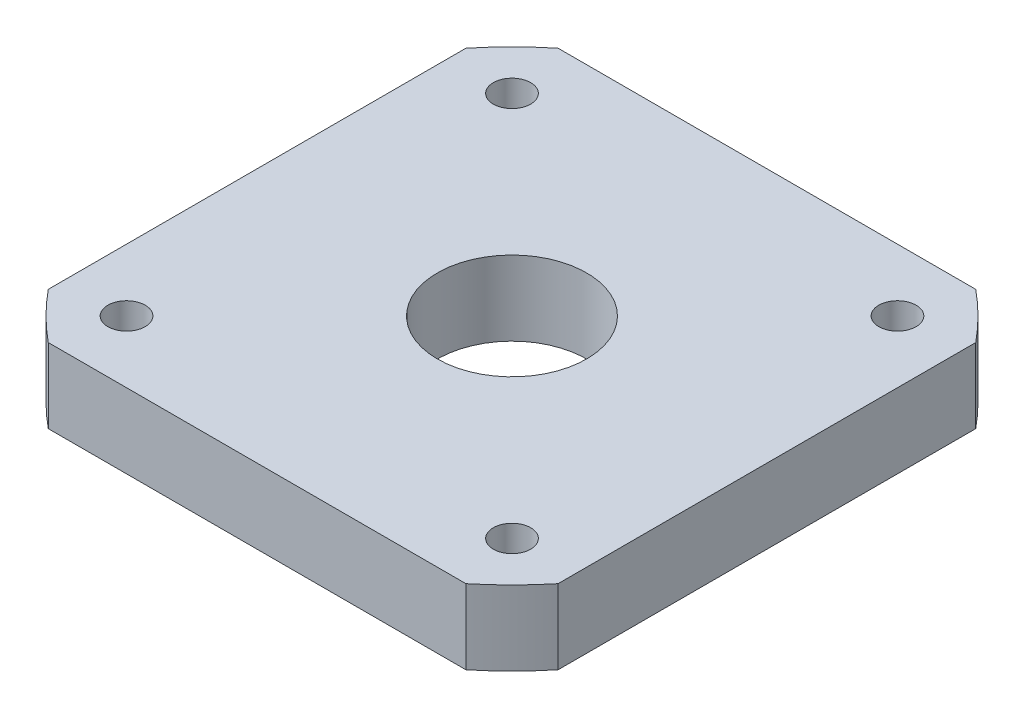
ISO-10303-21;
HEADER;
FILE_DESCRIPTION(('STEP AP214'),'2;1');
FILE_NAME('part.step','',(''),(''),'','','');
FILE_SCHEMA(('AUTOMOTIVE_DESIGN { 1 0 10303 214 1 1 1 1 }'));
ENDSEC;
DATA;
#1=APPLICATION_CONTEXT('core data for automotive mechanical design processes');
#2=APPLICATION_PROTOCOL_DEFINITION('international standard','automotive_design',2000,#1);
#3=PRODUCT_CONTEXT('',#1,'mechanical');
#4=PRODUCT('Part','Part','',(#3));
#5=PRODUCT_RELATED_PRODUCT_CATEGORY('part','',(#4));
#6=PRODUCT_DEFINITION_FORMATION('','',#4);
#7=PRODUCT_DEFINITION_CONTEXT('part definition',#1,'design');
#8=PRODUCT_DEFINITION('design','',#6,#7);
#9=PRODUCT_DEFINITION_SHAPE('','',#8);
#10=(LENGTH_UNIT() NAMED_UNIT(*) SI_UNIT(.MILLI.,.METRE.));
#11=(NAMED_UNIT(*) PLANE_ANGLE_UNIT() SI_UNIT($,.RADIAN.));
#12=(NAMED_UNIT(*) SI_UNIT($,.STERADIAN.) SOLID_ANGLE_UNIT());
#13=UNCERTAINTY_MEASURE_WITH_UNIT(LENGTH_MEASURE(1.E-05),#10,'distance_accuracy_value','');
#14=(GEOMETRIC_REPRESENTATION_CONTEXT(3) GLOBAL_UNCERTAINTY_ASSIGNED_CONTEXT((#13)) GLOBAL_UNIT_ASSIGNED_CONTEXT((#10,
#11,#12)) REPRESENTATION_CONTEXT('',''));
#15=CARTESIAN_POINT('',(0.,0.,0.));
#16=DIRECTION('',(0.,0.,1.));
#17=DIRECTION('',(1.,0.,0.));
#18=AXIS2_PLACEMENT_3D('',#15,#16,#17);
#19=CARTESIAN_POINT('',(0.,6.,0.));
#20=DIRECTION('',(0.,1.,0.));
#21=DIRECTION('',(0.,0.,1.));
#22=AXIS2_PLACEMENT_3D('',#19,#20,#21);
#23=PLANE('',#22);
#24=CARTESIAN_POINT('',(15.5000000000017,5.99999999999991,15.5));
#25=DIRECTION('',(0.,1.,0.));
#26=DIRECTION('',(0.,0.,1.));
#27=AXIS2_PLACEMENT_3D('',#24,#25,#26);
#28=CIRCLE('',#27,1.49999999999842);
#29=CARTESIAN_POINT('',(15.5000000000017,5.9999999999999,16.9999999999985));
#30=VERTEX_POINT('',#29);
#31=EDGE_CURVE('E199',#30,#30,#28,.T.);
#32=ORIENTED_EDGE('',*,*,#31,.F.);
#33=EDGE_LOOP('',(#32));
#34=FACE_BOUND('',#33,.T.);
#35=CARTESIAN_POINT('',(15.5000000000016,6.00000000000009,-15.5));
#36=DIRECTION('',(0.,1.,0.));
#37=DIRECTION('',(0.,0.,1.));
#38=AXIS2_PLACEMENT_3D('',#35,#36,#37);
#39=CIRCLE('',#38,1.49999999999842);
#40=CARTESIAN_POINT('',(15.5000000000016,6.00000000000008,-14.0000000000015));
#41=VERTEX_POINT('',#40);
#42=EDGE_CURVE('E189',#41,#41,#39,.T.);
#43=ORIENTED_EDGE('',*,*,#42,.F.);
#44=EDGE_LOOP('',(#43));
#45=FACE_BOUND('',#44,.T.);
#46=CARTESIAN_POINT('',(0.,6.,0.));
#47=DIRECTION('',(0.,1.,0.));
#48=DIRECTION('',(0.,0.,1.));
#49=AXIS2_PLACEMENT_3D('',#46,#47,#48);
#50=CIRCLE('',#49,26.5000000000002);
#51=CARTESIAN_POINT('',(20.5,6.0000000000001,-16.792855623747));
#52=VERTEX_POINT('',#51);
#53=CARTESIAN_POINT('',(16.792855623747,6.00000000000012,-20.5));
#54=VERTEX_POINT('',#53);
#55=EDGE_CURVE('E151',#52,#54,#50,.T.);
#56=ORIENTED_EDGE('',*,*,#55,.T.);
#57=DIRECTION('',(-1.,0.,0.));
#58=VECTOR('',#57,1.);
#59=CARTESIAN_POINT('',(16.792855623747,6.00000000000012,-20.5));
#60=LINE('',#59,#58);
#61=CARTESIAN_POINT('',(-16.79285562374,6.00000000000012,-20.5));
#62=VERTEX_POINT('',#61);
#63=EDGE_CURVE('E97',#54,#62,#60,.T.);
#64=ORIENTED_EDGE('',*,*,#63,.T.);
#65=CARTESIAN_POINT('',(0.,6.,0.));
#66=DIRECTION('',(0.,1.,0.));
#67=DIRECTION('',(0.,0.,1.));
#68=AXIS2_PLACEMENT_3D('',#65,#66,#67);
#69=CIRCLE('',#68,26.4999999999969);
#70=CARTESIAN_POINT('',(-20.4999999999974,6.0000000000001,-16.7928556237449));
#71=VERTEX_POINT('',#70);
#72=EDGE_CURVE('E167',#62,#71,#69,.T.);
#73=ORIENTED_EDGE('',*,*,#72,.T.);
#74=DIRECTION('',(0.,0.,1.));
#75=VECTOR('',#74,1.);
#76=CARTESIAN_POINT('',(-20.4999999999983,6.0000000000001,-16.7928556237456));
#77=LINE('',#76,#75);
#78=CARTESIAN_POINT('',(-20.5,5.9999999999999,16.79285562374));
#79=VERTEX_POINT('',#78);
#80=EDGE_CURVE('E176',#71,#79,#77,.T.);
#81=ORIENTED_EDGE('',*,*,#80,.T.);
#82=CARTESIAN_POINT('',(0.,6.,0.));
#83=DIRECTION('',(0.,1.,0.));
#84=DIRECTION('',(0.,0.,1.));
#85=AXIS2_PLACEMENT_3D('',#82,#83,#84);
#86=CIRCLE('',#85,26.4999999999958);
#87=CARTESIAN_POINT('',(-16.79285562374,5.99999999999988,20.5));
#88=VERTEX_POINT('',#87);
#89=EDGE_CURVE('E119',#79,#88,#86,.T.);
#90=ORIENTED_EDGE('',*,*,#89,.T.);
#91=DIRECTION('',(1.,0.,0.));
#92=VECTOR('',#91,1.);
#93=CARTESIAN_POINT('',(-16.79285562374,5.99999999999988,20.5));
#94=LINE('',#93,#92);
#95=CARTESIAN_POINT('',(16.792855623747,5.99999999999988,20.5));
#96=VERTEX_POINT('',#95);
#97=EDGE_CURVE('E115',#88,#96,#94,.T.);
#98=ORIENTED_EDGE('',*,*,#97,.T.);
#99=CARTESIAN_POINT('',(0.,6.,0.));
#100=DIRECTION('',(0.,1.,0.));
#101=DIRECTION('',(0.,0.,1.));
#102=AXIS2_PLACEMENT_3D('',#99,#100,#101);
#103=CIRCLE('',#102,26.4999999999991);
#104=CARTESIAN_POINT('',(20.5000000000026,5.9999999999999,16.7928556237421));
#105=VERTEX_POINT('',#104);
#106=EDGE_CURVE('E117',#96,#105,#103,.T.);
#107=ORIENTED_EDGE('',*,*,#106,.T.);
#108=DIRECTION('',(0.,0.,-1.));
#109=VECTOR('',#108,1.);
#110=CARTESIAN_POINT('',(20.5000000000017,5.9999999999999,16.7928556237414));
#111=LINE('',#110,#109);
#112=EDGE_CURVE('E57',#105,#52,#111,.T.);
#113=ORIENTED_EDGE('',*,*,#112,.T.);
#114=EDGE_LOOP('',(#56,#64,#73,#81,#90,#98,#107,#113));
#115=FACE_BOUND('',#114,.T.);
#116=CARTESIAN_POINT('',(0.,6.,0.));
#117=DIRECTION('',(0.,1.,0.));
#118=DIRECTION('',(0.,0.,1.));
#119=AXIS2_PLACEMENT_3D('',#116,#117,#118);
#120=CIRCLE('',#119,6.);
#121=CARTESIAN_POINT('',(0.,5.99999999999997,6.00000000000003));
#122=VERTEX_POINT('',#121);
#123=EDGE_CURVE('E138',#122,#122,#120,.T.);
#124=ORIENTED_EDGE('',*,*,#123,.F.);
#125=EDGE_LOOP('',(#124));
#126=FACE_BOUND('',#125,.T.);
#127=CARTESIAN_POINT('',(-15.5,6.00000000000009,-15.5));
#128=DIRECTION('',(0.,1.,0.));
#129=DIRECTION('',(0.,0.,1.));
#130=AXIS2_PLACEMENT_3D('',#127,#128,#129);
#131=CIRCLE('',#130,1.5);
#132=CARTESIAN_POINT('',(-15.5,6.00000000000008,-14.));
#133=VERTEX_POINT('',#132);
#134=EDGE_CURVE('E191',#133,#133,#131,.T.);
#135=ORIENTED_EDGE('',*,*,#134,.F.);
#136=EDGE_LOOP('',(#135));
#137=FACE_BOUND('',#136,.T.);
#138=CARTESIAN_POINT('',(-15.5,5.99999999999991,15.5));
#139=DIRECTION('',(0.,1.,0.));
#140=DIRECTION('',(0.,0.,1.));
#141=AXIS2_PLACEMENT_3D('',#138,#139,#140);
#142=CIRCLE('',#141,1.5);
#143=CARTESIAN_POINT('',(-15.5,5.9999999999999,17.));
#144=VERTEX_POINT('',#143);
#145=EDGE_CURVE('E206',#144,#144,#142,.T.);
#146=ORIENTED_EDGE('',*,*,#145,.F.);
#147=EDGE_LOOP('',(#146));
#148=FACE_BOUND('',#147,.T.);
#149=ADVANCED_FACE('F39',(#34,#45,#115,#126,#137,#148),#23,.T.);
#150=CARTESIAN_POINT('',(0.,0.,0.));
#151=DIRECTION('',(0.,1.,0.));
#152=DIRECTION('',(0.,0.,1.));
#153=AXIS2_PLACEMENT_3D('',#150,#151,#152);
#154=PLANE('',#153);
#155=CARTESIAN_POINT('',(0.,0.,0.));
#156=DIRECTION('',(0.,1.,0.));
#157=DIRECTION('',(0.,0.,1.));
#158=AXIS2_PLACEMENT_3D('',#155,#156,#157);
#159=CIRCLE('',#158,26.5000000000002);
#160=CARTESIAN_POINT('',(20.5,0.,-16.792855623747));
#161=VERTEX_POINT('',#160);
#162=CARTESIAN_POINT('',(16.792855623747,1.18140734892568E-13,-20.5));
#163=VERTEX_POINT('',#162);
#164=EDGE_CURVE('E137',#161,#163,#159,.T.);
#165=ORIENTED_EDGE('',*,*,#164,.F.);
#166=DIRECTION('',(0.,0.,-1.));
#167=VECTOR('',#166,1.);
#168=CARTESIAN_POINT('',(20.5000000000017,0.,16.7928556237414));
#169=LINE('',#168,#167);
#170=CARTESIAN_POINT('',(20.5000000000026,0.,16.7928556237421));
#171=VERTEX_POINT('',#170);
#172=EDGE_CURVE('E93',#171,#161,#169,.T.);
#173=ORIENTED_EDGE('',*,*,#172,.F.);
#174=CARTESIAN_POINT('',(0.,0.,0.));
#175=DIRECTION('',(0.,1.,0.));
#176=DIRECTION('',(0.,0.,1.));
#177=AXIS2_PLACEMENT_3D('',#174,#175,#176);
#178=CIRCLE('',#177,26.4999999999991);
#179=CARTESIAN_POINT('',(16.792855623747,-1.18140734892568E-13,20.5));
#180=VERTEX_POINT('',#179);
#181=EDGE_CURVE('E83',#180,#171,#178,.T.);
#182=ORIENTED_EDGE('',*,*,#181,.F.);
#183=DIRECTION('',(1.,0.,0.));
#184=VECTOR('',#183,1.);
#185=CARTESIAN_POINT('',(-16.79285562374,-1.18140734892568E-13,20.5));
#186=LINE('',#185,#184);
#187=CARTESIAN_POINT('',(-16.79285562374,-1.18140734892568E-13,20.5));
#188=VERTEX_POINT('',#187);
#189=EDGE_CURVE('E127',#188,#180,#186,.T.);
#190=ORIENTED_EDGE('',*,*,#189,.F.);
#191=CARTESIAN_POINT('',(0.,0.,0.));
#192=DIRECTION('',(0.,1.,0.));
#193=DIRECTION('',(0.,0.,1.));
#194=AXIS2_PLACEMENT_3D('',#191,#192,#193);
#195=CIRCLE('',#194,26.4999999999958);
#196=CARTESIAN_POINT('',(-20.5,0.,16.79285562374));
#197=VERTEX_POINT('',#196);
#198=EDGE_CURVE('E148',#197,#188,#195,.T.);
#199=ORIENTED_EDGE('',*,*,#198,.F.);
#200=DIRECTION('',(0.,0.,1.));
#201=VECTOR('',#200,1.);
#202=CARTESIAN_POINT('',(-20.4999999999983,0.,-16.7928556237456));
#203=LINE('',#202,#201);
#204=CARTESIAN_POINT('',(-20.4999999999974,0.,-16.7928556237449));
#205=VERTEX_POINT('',#204);
#206=EDGE_CURVE('E145',#205,#197,#203,.T.);
#207=ORIENTED_EDGE('',*,*,#206,.F.);
#208=CARTESIAN_POINT('',(0.,0.,0.));
#209=DIRECTION('',(0.,1.,0.));
#210=DIRECTION('',(0.,0.,1.));
#211=AXIS2_PLACEMENT_3D('',#208,#209,#210);
#212=CIRCLE('',#211,26.4999999999969);
#213=CARTESIAN_POINT('',(-16.79285562374,1.18140734892568E-13,-20.5));
#214=VERTEX_POINT('',#213);
#215=EDGE_CURVE('E142',#214,#205,#212,.T.);
#216=ORIENTED_EDGE('',*,*,#215,.F.);
#217=DIRECTION('',(-1.,0.,0.));
#218=VECTOR('',#217,1.);
#219=CARTESIAN_POINT('',(16.792855623747,1.18140734892568E-13,-20.5));
#220=LINE('',#219,#218);
#221=EDGE_CURVE('E136',#163,#214,#220,.T.);
#222=ORIENTED_EDGE('',*,*,#221,.F.);
#223=EDGE_LOOP('',(#165,#173,#182,#190,#199,#207,#216,#222));
#224=FACE_BOUND('',#223,.T.);
#225=CARTESIAN_POINT('',(0.,0.,0.));
#226=DIRECTION('',(0.,1.,0.));
#227=DIRECTION('',(0.,0.,1.));
#228=AXIS2_PLACEMENT_3D('',#225,#226,#227);
#229=CIRCLE('',#228,6.);
#230=CARTESIAN_POINT('',(0.,0.,6.));
#231=VERTEX_POINT('',#230);
#232=EDGE_CURVE('E183',#231,#231,#229,.T.);
#233=ORIENTED_EDGE('',*,*,#232,.T.);
#234=EDGE_LOOP('',(#233));
#235=FACE_BOUND('',#234,.T.);
#236=CARTESIAN_POINT('',(15.5000000000016,0.,-15.5));
#237=DIRECTION('',(0.,1.,0.));
#238=DIRECTION('',(0.,0.,1.));
#239=AXIS2_PLACEMENT_3D('',#236,#237,#238);
#240=CIRCLE('',#239,1.49999999999842);
#241=CARTESIAN_POINT('',(15.5000000000016,0.,-14.0000000000016));
#242=VERTEX_POINT('',#241);
#243=EDGE_CURVE('E192',#242,#242,#240,.T.);
#244=ORIENTED_EDGE('',*,*,#243,.T.);
#245=EDGE_LOOP('',(#244));
#246=FACE_BOUND('',#245,.T.);
#247=CARTESIAN_POINT('',(-15.5,0.,-15.5));
#248=DIRECTION('',(0.,1.,0.));
#249=DIRECTION('',(0.,0.,1.));
#250=AXIS2_PLACEMENT_3D('',#247,#248,#249);
#251=CIRCLE('',#250,1.5);
#252=CARTESIAN_POINT('',(-15.5,0.,-14.));
#253=VERTEX_POINT('',#252);
#254=EDGE_CURVE('E197',#253,#253,#251,.T.);
#255=ORIENTED_EDGE('',*,*,#254,.T.);
#256=EDGE_LOOP('',(#255));
#257=FACE_BOUND('',#256,.T.);
#258=CARTESIAN_POINT('',(15.5000000000017,0.,15.5));
#259=DIRECTION('',(0.,1.,0.));
#260=DIRECTION('',(0.,0.,1.));
#261=AXIS2_PLACEMENT_3D('',#258,#259,#260);
#262=CIRCLE('',#261,1.49999999999842);
#263=CARTESIAN_POINT('',(15.5000000000017,0.,16.9999999999984));
#264=VERTEX_POINT('',#263);
#265=EDGE_CURVE('E201',#264,#264,#262,.T.);
#266=ORIENTED_EDGE('',*,*,#265,.T.);
#267=EDGE_LOOP('',(#266));
#268=FACE_BOUND('',#267,.T.);
#269=CARTESIAN_POINT('',(-15.5,0.,15.5));
#270=DIRECTION('',(0.,1.,0.));
#271=DIRECTION('',(0.,0.,1.));
#272=AXIS2_PLACEMENT_3D('',#269,#270,#271);
#273=CIRCLE('',#272,1.5);
#274=CARTESIAN_POINT('',(-15.5,0.,17.));
#275=VERTEX_POINT('',#274);
#276=EDGE_CURVE('E207',#275,#275,#273,.T.);
#277=ORIENTED_EDGE('',*,*,#276,.T.);
#278=EDGE_LOOP('',(#277));
#279=FACE_BOUND('',#278,.T.);
#280=ADVANCED_FACE('F168',(#224,#235,#246,#257,#268,#279),#154,.F.);
#281=CARTESIAN_POINT('',(0.,6.,0.));
#282=DIRECTION('',(0.,-1.,0.));
#283=DIRECTION('',(0.,0.,-1.));
#284=AXIS2_PLACEMENT_3D('',#281,#282,#283);
#285=CYLINDRICAL_SURFACE('',#284,26.5000000000002);
#286=ORIENTED_EDGE('',*,*,#164,.T.);
#287=DIRECTION('',(0.,-1.,0.));
#288=VECTOR('',#287,1.);
#289=CARTESIAN_POINT('',(16.792855623747,6.00000000000012,-20.5));
#290=LINE('',#289,#288);
#291=EDGE_CURVE('E11',#54,#163,#290,.T.);
#292=ORIENTED_EDGE('',*,*,#291,.F.);
#293=ORIENTED_EDGE('',*,*,#55,.F.);
#294=DIRECTION('',(0.,-1.,0.));
#295=VECTOR('',#294,1.);
#296=CARTESIAN_POINT('',(20.5,6.0000000000001,-16.792855623747));
#297=LINE('',#296,#295);
#298=EDGE_CURVE('E135',#52,#161,#297,.T.);
#299=ORIENTED_EDGE('',*,*,#298,.T.);
#300=EDGE_LOOP('',(#286,#292,#293,#299));
#301=FACE_BOUND('',#300,.T.);
#302=ADVANCED_FACE('F41',(#301),#285,.T.);
#303=CARTESIAN_POINT('',(16.792855623747,6.00000000000012,-20.5));
#304=DIRECTION('',(0.,0.,1.));
#305=DIRECTION('',(0.,-1.,0.));
#306=AXIS2_PLACEMENT_3D('',#303,#304,#305);
#307=PLANE('',#306);
#308=ORIENTED_EDGE('',*,*,#221,.T.);
#309=DIRECTION('',(0.,-1.,0.));
#310=VECTOR('',#309,1.);
#311=CARTESIAN_POINT('',(-16.79285562374,6.00000000000012,-20.5));
#312=LINE('',#311,#310);
#313=EDGE_CURVE('E48',#62,#214,#312,.T.);
#314=ORIENTED_EDGE('',*,*,#313,.F.);
#315=ORIENTED_EDGE('',*,*,#63,.F.);
#316=ORIENTED_EDGE('',*,*,#291,.T.);
#317=EDGE_LOOP('',(#308,#314,#315,#316));
#318=FACE_BOUND('',#317,.T.);
#319=ADVANCED_FACE('F244',(#318),#307,.F.);
#320=CARTESIAN_POINT('',(0.,6.,0.));
#321=DIRECTION('',(0.,-1.,0.));
#322=DIRECTION('',(0.,0.,-1.));
#323=AXIS2_PLACEMENT_3D('',#320,#321,#322);
#324=CYLINDRICAL_SURFACE('',#323,26.4999999999969);
#325=ORIENTED_EDGE('',*,*,#215,.T.);
#326=DIRECTION('',(0.,-1.,0.));
#327=VECTOR('',#326,1.);
#328=CARTESIAN_POINT('',(-20.4999999999974,6.0000000000001,-16.7928556237449));
#329=LINE('',#328,#327);
#330=EDGE_CURVE('E158',#71,#205,#329,.T.);
#331=ORIENTED_EDGE('',*,*,#330,.F.);
#332=ORIENTED_EDGE('',*,*,#72,.F.);
#333=ORIENTED_EDGE('',*,*,#313,.T.);
#334=EDGE_LOOP('',(#325,#331,#332,#333));
#335=FACE_BOUND('',#334,.T.);
#336=ADVANCED_FACE('F163',(#335),#324,.T.);
#337=CARTESIAN_POINT('',(-20.4999999999983,6.0000000000001,-16.7928556237456));
#338=DIRECTION('',(1.,0.,0.));
#339=DIRECTION('',(0.,0.,-1.));
#340=AXIS2_PLACEMENT_3D('',#337,#338,#339);
#341=PLANE('',#340);
#342=ORIENTED_EDGE('',*,*,#206,.T.);
#343=DIRECTION('',(0.,-1.,0.));
#344=VECTOR('',#343,1.);
#345=CARTESIAN_POINT('',(-20.5,5.9999999999999,16.79285562374));
#346=LINE('',#345,#344);
#347=EDGE_CURVE('E154',#79,#197,#346,.T.);
#348=ORIENTED_EDGE('',*,*,#347,.F.);
#349=ORIENTED_EDGE('',*,*,#80,.F.);
#350=ORIENTED_EDGE('',*,*,#330,.T.);
#351=EDGE_LOOP('',(#342,#348,#349,#350));
#352=FACE_BOUND('',#351,.T.);
#353=ADVANCED_FACE('F173',(#352),#341,.F.);
#354=CARTESIAN_POINT('',(0.,6.,0.));
#355=DIRECTION('',(0.,-1.,0.));
#356=DIRECTION('',(0.,0.,-1.));
#357=AXIS2_PLACEMENT_3D('',#354,#355,#356);
#358=CYLINDRICAL_SURFACE('',#357,26.4999999999958);
#359=ORIENTED_EDGE('',*,*,#198,.T.);
#360=DIRECTION('',(0.,-1.,0.));
#361=VECTOR('',#360,1.);
#362=CARTESIAN_POINT('',(-16.79285562374,5.99999999999988,20.5));
#363=LINE('',#362,#361);
#364=EDGE_CURVE('E130',#88,#188,#363,.T.);
#365=ORIENTED_EDGE('',*,*,#364,.F.);
#366=ORIENTED_EDGE('',*,*,#89,.F.);
#367=ORIENTED_EDGE('',*,*,#347,.T.);
#368=EDGE_LOOP('',(#359,#365,#366,#367));
#369=FACE_BOUND('',#368,.T.);
#370=ADVANCED_FACE('F179',(#369),#358,.T.);
#371=CARTESIAN_POINT('',(-16.79285562374,5.99999999999988,20.5));
#372=DIRECTION('',(0.,0.,-1.));
#373=DIRECTION('',(0.,1.,0.));
#374=AXIS2_PLACEMENT_3D('',#371,#372,#373);
#375=PLANE('',#374);
#376=ORIENTED_EDGE('',*,*,#189,.T.);
#377=DIRECTION('',(0.,-1.,0.));
#378=VECTOR('',#377,1.);
#379=CARTESIAN_POINT('',(16.792855623747,5.99999999999988,20.5));
#380=LINE('',#379,#378);
#381=EDGE_CURVE('E124',#96,#180,#380,.T.);
#382=ORIENTED_EDGE('',*,*,#381,.F.);
#383=ORIENTED_EDGE('',*,*,#97,.F.);
#384=ORIENTED_EDGE('',*,*,#364,.T.);
#385=EDGE_LOOP('',(#376,#382,#383,#384));
#386=FACE_BOUND('',#385,.T.);
#387=ADVANCED_FACE('F121',(#386),#375,.F.);
#388=CARTESIAN_POINT('',(0.,6.,0.));
#389=DIRECTION('',(0.,-1.,0.));
#390=DIRECTION('',(0.,0.,-1.));
#391=AXIS2_PLACEMENT_3D('',#388,#389,#390);
#392=CYLINDRICAL_SURFACE('',#391,26.4999999999991);
#393=ORIENTED_EDGE('',*,*,#181,.T.);
#394=DIRECTION('',(0.,-1.,0.));
#395=VECTOR('',#394,1.);
#396=CARTESIAN_POINT('',(20.5000000000026,5.9999999999999,16.7928556237421));
#397=LINE('',#396,#395);
#398=EDGE_CURVE('E126',#105,#171,#397,.T.);
#399=ORIENTED_EDGE('',*,*,#398,.F.);
#400=ORIENTED_EDGE('',*,*,#106,.F.);
#401=ORIENTED_EDGE('',*,*,#381,.T.);
#402=EDGE_LOOP('',(#393,#399,#400,#401));
#403=FACE_BOUND('',#402,.T.);
#404=ADVANCED_FACE('F128',(#403),#392,.T.);
#405=CARTESIAN_POINT('',(20.5000000000017,5.9999999999999,16.7928556237414));
#406=DIRECTION('',(-1.,0.,0.));
#407=DIRECTION('',(0.,0.,1.));
#408=AXIS2_PLACEMENT_3D('',#405,#406,#407);
#409=PLANE('',#408);
#410=ORIENTED_EDGE('',*,*,#172,.T.);
#411=ORIENTED_EDGE('',*,*,#298,.F.);
#412=ORIENTED_EDGE('',*,*,#112,.F.);
#413=ORIENTED_EDGE('',*,*,#398,.T.);
#414=EDGE_LOOP('',(#410,#411,#412,#413));
#415=FACE_BOUND('',#414,.T.);
#416=ADVANCED_FACE('F232',(#415),#409,.F.);
#417=CARTESIAN_POINT('',(0.,6.,0.));
#418=DIRECTION('',(0.,-1.,0.));
#419=DIRECTION('',(0.,0.,-1.));
#420=AXIS2_PLACEMENT_3D('',#417,#418,#419);
#421=CYLINDRICAL_SURFACE('',#420,6.);
#422=ORIENTED_EDGE('',*,*,#123,.T.);
#423=EDGE_LOOP('',(#422));
#424=FACE_BOUND('',#423,.T.);
#425=ORIENTED_EDGE('',*,*,#232,.F.);
#426=EDGE_LOOP('',(#425));
#427=FACE_BOUND('',#426,.T.);
#428=ADVANCED_FACE('F229',(#424,#427),#421,.F.);
#429=CARTESIAN_POINT('',(15.5000000000016,6.00000000000009,-15.5));
#430=DIRECTION('',(0.,-1.,0.));
#431=DIRECTION('',(0.,0.,-1.));
#432=AXIS2_PLACEMENT_3D('',#429,#430,#431);
#433=CYLINDRICAL_SURFACE('',#432,1.49999999999842);
#434=ORIENTED_EDGE('',*,*,#42,.T.);
#435=EDGE_LOOP('',(#434));
#436=FACE_BOUND('',#435,.T.);
#437=ORIENTED_EDGE('',*,*,#243,.F.);
#438=EDGE_LOOP('',(#437));
#439=FACE_BOUND('',#438,.T.);
#440=ADVANCED_FACE('F308',(#436,#439),#433,.F.);
#441=CARTESIAN_POINT('',(-15.5,6.00000000000009,-15.5));
#442=DIRECTION('',(0.,-1.,0.));
#443=DIRECTION('',(0.,0.,-1.));
#444=AXIS2_PLACEMENT_3D('',#441,#442,#443);
#445=CYLINDRICAL_SURFACE('',#444,1.5);
#446=ORIENTED_EDGE('',*,*,#134,.T.);
#447=EDGE_LOOP('',(#446));
#448=FACE_BOUND('',#447,.T.);
#449=ORIENTED_EDGE('',*,*,#254,.F.);
#450=EDGE_LOOP('',(#449));
#451=FACE_BOUND('',#450,.T.);
#452=ADVANCED_FACE('F314',(#448,#451),#445,.F.);
#453=CARTESIAN_POINT('',(15.5000000000017,5.99999999999991,15.5));
#454=DIRECTION('',(0.,-1.,0.));
#455=DIRECTION('',(0.,0.,-1.));
#456=AXIS2_PLACEMENT_3D('',#453,#454,#455);
#457=CYLINDRICAL_SURFACE('',#456,1.49999999999842);
#458=ORIENTED_EDGE('',*,*,#31,.T.);
#459=EDGE_LOOP('',(#458));
#460=FACE_BOUND('',#459,.T.);
#461=ORIENTED_EDGE('',*,*,#265,.F.);
#462=EDGE_LOOP('',(#461));
#463=FACE_BOUND('',#462,.T.);
#464=ADVANCED_FACE('F325',(#460,#463),#457,.F.);
#465=CARTESIAN_POINT('',(-15.5,5.99999999999991,15.5));
#466=DIRECTION('',(0.,-1.,0.));
#467=DIRECTION('',(0.,0.,-1.));
#468=AXIS2_PLACEMENT_3D('',#465,#466,#467);
#469=CYLINDRICAL_SURFACE('',#468,1.5);
#470=ORIENTED_EDGE('',*,*,#145,.T.);
#471=EDGE_LOOP('',(#470));
#472=FACE_BOUND('',#471,.T.);
#473=ORIENTED_EDGE('',*,*,#276,.F.);
#474=EDGE_LOOP('',(#473));
#475=FACE_BOUND('',#474,.T.);
#476=ADVANCED_FACE('F214',(#472,#475),#469,.F.);
#477=CLOSED_SHELL('',(#149,#280,#302,#319,#336,#353,#370,#387,#404,#416,#428,#440,#452,#464,#476));
#478=MANIFOLD_SOLID_BREP('B2',#477);
#479=ADVANCED_BREP_SHAPE_REPRESENTATION('',(#18,#478),#14);
#480=SHAPE_DEFINITION_REPRESENTATION(#9,#479);
ENDSEC;
END-ISO-10303-21;
